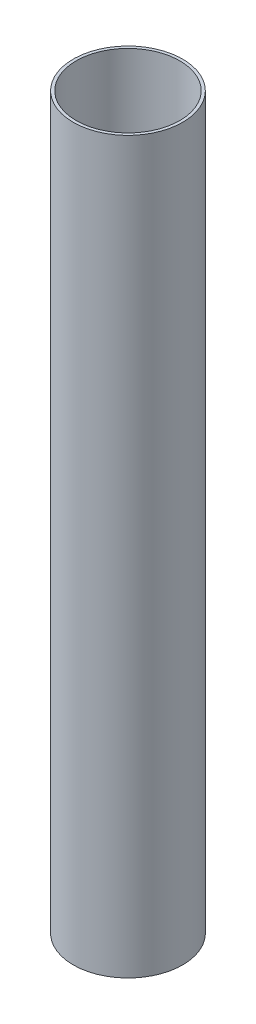
ISO-10303-21;
HEADER;
FILE_DESCRIPTION(('STEP AP214'),'2;1');
FILE_NAME('part.step','',(''),(''),'','','');
FILE_SCHEMA(('AUTOMOTIVE_DESIGN { 1 0 10303 214 1 1 1 1 }'));
ENDSEC;
DATA;
#1=APPLICATION_CONTEXT('core data for automotive mechanical design processes');
#2=APPLICATION_PROTOCOL_DEFINITION('international standard','automotive_design',2000,#1);
#3=PRODUCT_CONTEXT('',#1,'mechanical');
#4=PRODUCT('Part','Part','',(#3));
#5=PRODUCT_RELATED_PRODUCT_CATEGORY('part','',(#4));
#6=PRODUCT_DEFINITION_FORMATION('','',#4);
#7=PRODUCT_DEFINITION_CONTEXT('part definition',#1,'design');
#8=PRODUCT_DEFINITION('design','',#6,#7);
#9=PRODUCT_DEFINITION_SHAPE('','',#8);
#10=(LENGTH_UNIT() NAMED_UNIT(*) SI_UNIT(.MILLI.,.METRE.));
#11=(NAMED_UNIT(*) PLANE_ANGLE_UNIT() SI_UNIT($,.RADIAN.));
#12=(NAMED_UNIT(*) SI_UNIT($,.STERADIAN.) SOLID_ANGLE_UNIT());
#13=UNCERTAINTY_MEASURE_WITH_UNIT(LENGTH_MEASURE(1.E-05),#10,'distance_accuracy_value','');
#14=(GEOMETRIC_REPRESENTATION_CONTEXT(3) GLOBAL_UNCERTAINTY_ASSIGNED_CONTEXT((#13)) GLOBAL_UNIT_ASSIGNED_CONTEXT((#10,
#11,#12)) REPRESENTATION_CONTEXT('',''));
#15=CARTESIAN_POINT('',(0.,0.,0.));
#16=DIRECTION('',(0.,0.,1.));
#17=DIRECTION('',(1.,0.,0.));
#18=AXIS2_PLACEMENT_3D('',#15,#16,#17);
#19=CARTESIAN_POINT('',(0.,500.,0.));
#20=DIRECTION('',(0.,1.,0.));
#21=DIRECTION('',(0.,0.,1.));
#22=AXIS2_PLACEMENT_3D('',#19,#20,#21);
#23=PLANE('',#22);
#24=CARTESIAN_POINT('',(0.,500.,0.));
#25=DIRECTION('',(0.,1.,0.));
#26=DIRECTION('',(0.,0.,1.));
#27=AXIS2_PLACEMENT_3D('',#24,#25,#26);
#28=CIRCLE('',#27,37.5);
#29=CARTESIAN_POINT('',(0.,500.,37.5));
#30=VERTEX_POINT('',#29);
#31=EDGE_CURVE('E10',#30,#30,#28,.T.);
#32=ORIENTED_EDGE('',*,*,#31,.T.);
#33=EDGE_LOOP('',(#32));
#34=FACE_BOUND('',#33,.T.);
#35=CARTESIAN_POINT('',(0.,500.,0.));
#36=DIRECTION('',(0.,1.,0.));
#37=DIRECTION('',(0.,0.,1.));
#38=AXIS2_PLACEMENT_3D('',#35,#36,#37);
#39=CIRCLE('',#38,35.5);
#40=CARTESIAN_POINT('',(0.,500.,35.5));
#41=VERTEX_POINT('',#40);
#42=EDGE_CURVE('E47',#41,#41,#39,.T.);
#43=ORIENTED_EDGE('',*,*,#42,.F.);
#44=EDGE_LOOP('',(#43));
#45=FACE_BOUND('',#44,.T.);
#46=ADVANCED_FACE('F36',(#34,#45),#23,.T.);
#47=CARTESIAN_POINT('',(0.,0.,0.));
#48=DIRECTION('',(0.,1.,0.));
#49=DIRECTION('',(0.,0.,1.));
#50=AXIS2_PLACEMENT_3D('',#47,#48,#49);
#51=PLANE('',#50);
#52=CARTESIAN_POINT('',(0.,0.,0.));
#53=DIRECTION('',(0.,1.,0.));
#54=DIRECTION('',(0.,0.,1.));
#55=AXIS2_PLACEMENT_3D('',#52,#53,#54);
#56=CIRCLE('',#55,37.5);
#57=CARTESIAN_POINT('',(0.,0.,37.5));
#58=VERTEX_POINT('',#57);
#59=EDGE_CURVE('E40',#58,#58,#56,.T.);
#60=ORIENTED_EDGE('',*,*,#59,.F.);
#61=EDGE_LOOP('',(#60));
#62=FACE_BOUND('',#61,.T.);
#63=CARTESIAN_POINT('',(0.,0.,0.));
#64=DIRECTION('',(0.,1.,0.));
#65=DIRECTION('',(0.,0.,1.));
#66=AXIS2_PLACEMENT_3D('',#63,#64,#65);
#67=CIRCLE('',#66,35.5);
#68=CARTESIAN_POINT('',(0.,0.,35.5));
#69=VERTEX_POINT('',#68);
#70=EDGE_CURVE('E49',#69,#69,#67,.T.);
#71=ORIENTED_EDGE('',*,*,#70,.T.);
#72=EDGE_LOOP('',(#71));
#73=FACE_BOUND('',#72,.T.);
#74=ADVANCED_FACE('F59',(#62,#73),#51,.F.);
#75=CARTESIAN_POINT('',(0.,500.,0.));
#76=DIRECTION('',(0.,-1.,0.));
#77=DIRECTION('',(0.,0.,-1.));
#78=AXIS2_PLACEMENT_3D('',#75,#76,#77);
#79=CYLINDRICAL_SURFACE('',#78,37.5);
#80=ORIENTED_EDGE('',*,*,#31,.F.);
#81=EDGE_LOOP('',(#80));
#82=FACE_BOUND('',#81,.T.);
#83=ORIENTED_EDGE('',*,*,#59,.T.);
#84=EDGE_LOOP('',(#83));
#85=FACE_BOUND('',#84,.T.);
#86=ADVANCED_FACE('F38',(#82,#85),#79,.T.);
#87=CARTESIAN_POINT('',(0.,500.,0.));
#88=DIRECTION('',(0.,-1.,0.));
#89=DIRECTION('',(0.,0.,-1.));
#90=AXIS2_PLACEMENT_3D('',#87,#88,#89);
#91=CYLINDRICAL_SURFACE('',#90,35.5);
#92=ORIENTED_EDGE('',*,*,#42,.T.);
#93=EDGE_LOOP('',(#92));
#94=FACE_BOUND('',#93,.T.);
#95=ORIENTED_EDGE('',*,*,#70,.F.);
#96=EDGE_LOOP('',(#95));
#97=FACE_BOUND('',#96,.T.);
#98=ADVANCED_FACE('F55',(#94,#97),#91,.F.);
#99=CLOSED_SHELL('',(#46,#74,#86,#98));
#100=MANIFOLD_SOLID_BREP('B2',#99);
#101=ADVANCED_BREP_SHAPE_REPRESENTATION('',(#18,#100),#14);
#102=SHAPE_DEFINITION_REPRESENTATION(#9,#101);
ENDSEC;
END-ISO-10303-21;
